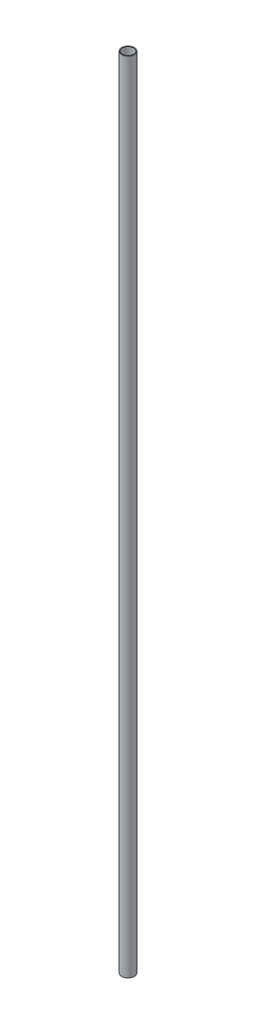
ISO-10303-21;
HEADER;
FILE_DESCRIPTION(('STEP AP214'),'2;1');
FILE_NAME('part.step','',(''),(''),'','','');
FILE_SCHEMA(('AUTOMOTIVE_DESIGN { 1 0 10303 214 1 1 1 1 }'));
ENDSEC;
DATA;
#1=APPLICATION_CONTEXT('core data for automotive mechanical design processes');
#2=APPLICATION_PROTOCOL_DEFINITION('international standard','automotive_design',2000,#1);
#3=PRODUCT_CONTEXT('',#1,'mechanical');
#4=PRODUCT('Part','Part','',(#3));
#5=PRODUCT_RELATED_PRODUCT_CATEGORY('part','',(#4));
#6=PRODUCT_DEFINITION_FORMATION('','',#4);
#7=PRODUCT_DEFINITION_CONTEXT('part definition',#1,'design');
#8=PRODUCT_DEFINITION('design','',#6,#7);
#9=PRODUCT_DEFINITION_SHAPE('','',#8);
#10=(LENGTH_UNIT() NAMED_UNIT(*) SI_UNIT(.MILLI.,.METRE.));
#11=(NAMED_UNIT(*) PLANE_ANGLE_UNIT() SI_UNIT($,.RADIAN.));
#12=(NAMED_UNIT(*) SI_UNIT($,.STERADIAN.) SOLID_ANGLE_UNIT());
#13=UNCERTAINTY_MEASURE_WITH_UNIT(LENGTH_MEASURE(1.E-05),#10,'distance_accuracy_value','');
#14=(GEOMETRIC_REPRESENTATION_CONTEXT(3) GLOBAL_UNCERTAINTY_ASSIGNED_CONTEXT((#13)) GLOBAL_UNIT_ASSIGNED_CONTEXT((#10,
#11,#12)) REPRESENTATION_CONTEXT('',''));
#15=CARTESIAN_POINT('',(0.,0.,0.));
#16=DIRECTION('',(0.,0.,1.));
#17=DIRECTION('',(1.,0.,0.));
#18=AXIS2_PLACEMENT_3D('',#15,#16,#17);
#19=CARTESIAN_POINT('',(0.,1150.,0.));
#20=DIRECTION('',(0.,1.,0.));
#21=DIRECTION('',(0.,0.,1.));
#22=AXIS2_PLACEMENT_3D('',#19,#20,#21);
#23=PLANE('',#22);
#24=CARTESIAN_POINT('',(0.,1150.,0.));
#25=DIRECTION('',(0.,1.,0.));
#26=DIRECTION('',(0.,0.,1.));
#27=AXIS2_PLACEMENT_3D('',#24,#25,#26);
#28=CIRCLE('',#27,9.);
#29=CARTESIAN_POINT('',(0.,1150.,9.));
#30=VERTEX_POINT('',#29);
#31=EDGE_CURVE('E10',#30,#30,#28,.T.);
#32=ORIENTED_EDGE('',*,*,#31,.T.);
#33=EDGE_LOOP('',(#32));
#34=FACE_BOUND('',#33,.T.);
#35=CARTESIAN_POINT('',(0.,1150.,0.));
#36=DIRECTION('',(0.,1.,0.));
#37=DIRECTION('',(0.,0.,1.));
#38=AXIS2_PLACEMENT_3D('',#35,#36,#37);
#39=CIRCLE('',#38,8.);
#40=CARTESIAN_POINT('',(0.,1150.,8.));
#41=VERTEX_POINT('',#40);
#42=EDGE_CURVE('E43',#41,#41,#39,.T.);
#43=ORIENTED_EDGE('',*,*,#42,.F.);
#44=EDGE_LOOP('',(#43));
#45=FACE_BOUND('',#44,.T.);
#46=ADVANCED_FACE('F32',(#34,#45),#23,.T.);
#47=CARTESIAN_POINT('',(0.,0.,0.));
#48=DIRECTION('',(0.,1.,0.));
#49=DIRECTION('',(0.,0.,1.));
#50=AXIS2_PLACEMENT_3D('',#47,#48,#49);
#51=PLANE('',#50);
#52=CARTESIAN_POINT('',(0.,0.,0.));
#53=DIRECTION('',(0.,1.,0.));
#54=DIRECTION('',(0.,0.,1.));
#55=AXIS2_PLACEMENT_3D('',#52,#53,#54);
#56=CIRCLE('',#55,9.);
#57=CARTESIAN_POINT('',(0.,0.,9.));
#58=VERTEX_POINT('',#57);
#59=EDGE_CURVE('E36',#58,#58,#56,.T.);
#60=ORIENTED_EDGE('',*,*,#59,.F.);
#61=EDGE_LOOP('',(#60));
#62=FACE_BOUND('',#61,.T.);
#63=CARTESIAN_POINT('',(0.,0.,0.));
#64=DIRECTION('',(0.,1.,0.));
#65=DIRECTION('',(0.,0.,1.));
#66=AXIS2_PLACEMENT_3D('',#63,#64,#65);
#67=CIRCLE('',#66,8.);
#68=CARTESIAN_POINT('',(0.,0.,8.));
#69=VERTEX_POINT('',#68);
#70=EDGE_CURVE('E45',#69,#69,#67,.T.);
#71=ORIENTED_EDGE('',*,*,#70,.T.);
#72=EDGE_LOOP('',(#71));
#73=FACE_BOUND('',#72,.T.);
#74=ADVANCED_FACE('F55',(#62,#73),#51,.F.);
#75=CARTESIAN_POINT('',(0.,1150.,0.));
#76=DIRECTION('',(0.,-1.,0.));
#77=DIRECTION('',(0.,0.,-1.));
#78=AXIS2_PLACEMENT_3D('',#75,#76,#77);
#79=CYLINDRICAL_SURFACE('',#78,9.);
#80=ORIENTED_EDGE('',*,*,#31,.F.);
#81=EDGE_LOOP('',(#80));
#82=FACE_BOUND('',#81,.T.);
#83=ORIENTED_EDGE('',*,*,#59,.T.);
#84=EDGE_LOOP('',(#83));
#85=FACE_BOUND('',#84,.T.);
#86=ADVANCED_FACE('F34',(#82,#85),#79,.T.);
#87=CARTESIAN_POINT('',(0.,1150.,0.));
#88=DIRECTION('',(0.,-1.,0.));
#89=DIRECTION('',(0.,0.,-1.));
#90=AXIS2_PLACEMENT_3D('',#87,#88,#89);
#91=CYLINDRICAL_SURFACE('',#90,8.);
#92=ORIENTED_EDGE('',*,*,#42,.T.);
#93=EDGE_LOOP('',(#92));
#94=FACE_BOUND('',#93,.T.);
#95=ORIENTED_EDGE('',*,*,#70,.F.);
#96=EDGE_LOOP('',(#95));
#97=FACE_BOUND('',#96,.T.);
#98=ADVANCED_FACE('F51',(#94,#97),#91,.F.);
#99=CLOSED_SHELL('',(#46,#74,#86,#98));
#100=MANIFOLD_SOLID_BREP('B2',#99);
#101=ADVANCED_BREP_SHAPE_REPRESENTATION('',(#18,#100),#14);
#102=SHAPE_DEFINITION_REPRESENTATION(#9,#101);
ENDSEC;
END-ISO-10303-21;
